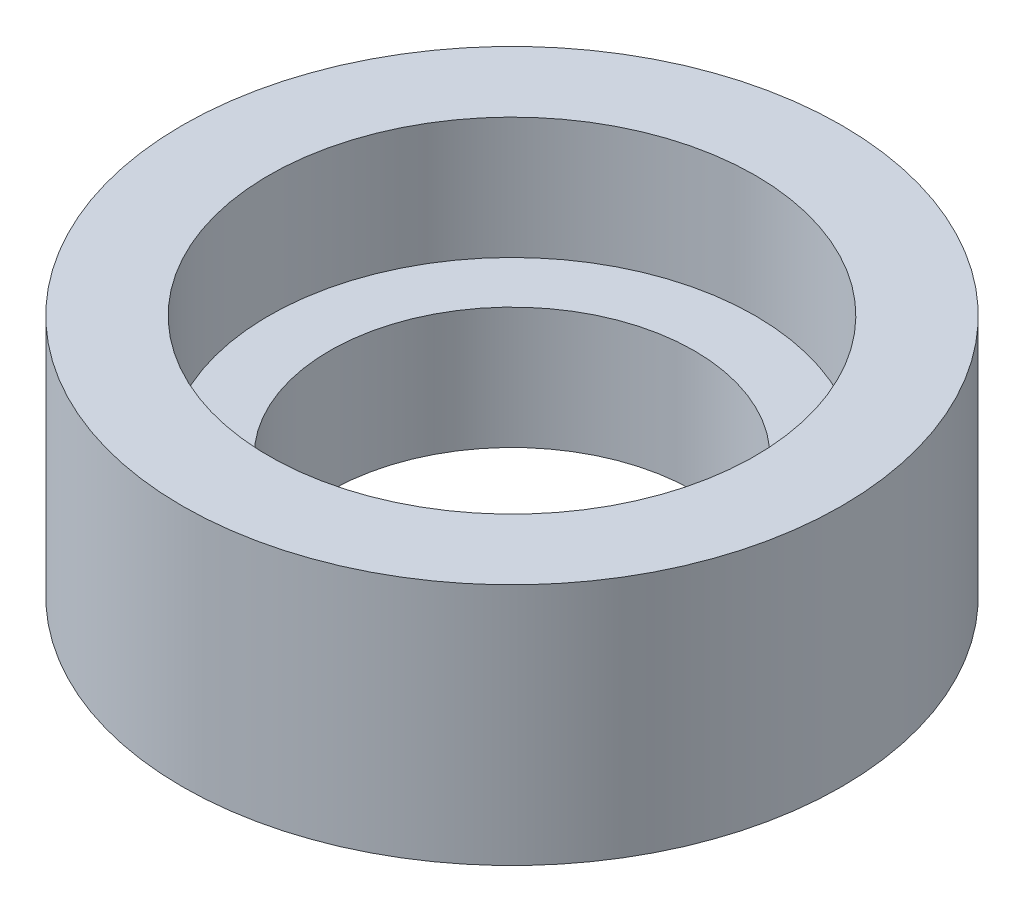
ISO-10303-21;
HEADER;
FILE_DESCRIPTION(('STEP AP214'),'2;1');
FILE_NAME('part.step','',(''),(''),'','','');
FILE_SCHEMA(('AUTOMOTIVE_DESIGN { 1 0 10303 214 1 1 1 1 }'));
ENDSEC;
DATA;
#1=APPLICATION_CONTEXT('core data for automotive mechanical design processes');
#2=APPLICATION_PROTOCOL_DEFINITION('international standard','automotive_design',2000,#1);
#3=PRODUCT_CONTEXT('',#1,'mechanical');
#4=PRODUCT('Part','Part','',(#3));
#5=PRODUCT_RELATED_PRODUCT_CATEGORY('part','',(#4));
#6=PRODUCT_DEFINITION_FORMATION('','',#4);
#7=PRODUCT_DEFINITION_CONTEXT('part definition',#1,'design');
#8=PRODUCT_DEFINITION('design','',#6,#7);
#9=PRODUCT_DEFINITION_SHAPE('','',#8);
#10=(LENGTH_UNIT() NAMED_UNIT(*) SI_UNIT(.MILLI.,.METRE.));
#11=(NAMED_UNIT(*) PLANE_ANGLE_UNIT() SI_UNIT($,.RADIAN.));
#12=(NAMED_UNIT(*) SI_UNIT($,.STERADIAN.) SOLID_ANGLE_UNIT());
#13=UNCERTAINTY_MEASURE_WITH_UNIT(LENGTH_MEASURE(1.E-05),#10,'distance_accuracy_value','');
#14=(GEOMETRIC_REPRESENTATION_CONTEXT(3) GLOBAL_UNCERTAINTY_ASSIGNED_CONTEXT((#13)) GLOBAL_UNIT_ASSIGNED_CONTEXT((#10,
#11,#12)) REPRESENTATION_CONTEXT('',''));
#15=CARTESIAN_POINT('',(0.,0.,0.));
#16=DIRECTION('',(0.,0.,1.));
#17=DIRECTION('',(1.,0.,0.));
#18=AXIS2_PLACEMENT_3D('',#15,#16,#17);
#19=CARTESIAN_POINT('',(-3.175,3.175,0.));
#20=DIRECTION('',(0.,-1.,0.));
#21=DIRECTION('',(0.,0.,-1.));
#22=AXIS2_PLACEMENT_3D('',#19,#20,#21);
#23=PLANE('',#22);
#24=CARTESIAN_POINT('',(0.,3.175,0.));
#25=DIRECTION('',(0.,-1.,0.));
#26=DIRECTION('',(0.,0.,-1.));
#27=AXIS2_PLACEMENT_3D('',#24,#25,#26);
#28=CIRCLE('',#27,4.3053);
#29=CARTESIAN_POINT('',(0.,3.175,-4.3053));
#30=VERTEX_POINT('',#29);
#31=EDGE_CURVE('E10',#30,#30,#28,.T.);
#32=ORIENTED_EDGE('',*,*,#31,.F.);
#33=EDGE_LOOP('',(#32));
#34=FACE_BOUND('',#33,.T.);
#35=CARTESIAN_POINT('',(0.,3.175,0.));
#36=DIRECTION('',(0.,-1.,0.));
#37=DIRECTION('',(0.,0.,-1.));
#38=AXIS2_PLACEMENT_3D('',#35,#36,#37);
#39=CIRCLE('',#38,3.175);
#40=CARTESIAN_POINT('',(0.,3.175,-3.175));
#41=VERTEX_POINT('',#40);
#42=EDGE_CURVE('E64',#41,#41,#39,.T.);
#43=ORIENTED_EDGE('',*,*,#42,.T.);
#44=EDGE_LOOP('',(#43));
#45=FACE_BOUND('',#44,.T.);
#46=ADVANCED_FACE('F37',(#34,#45),#23,.F.);
#47=CARTESIAN_POINT('',(0.,0.,0.));
#48=DIRECTION('',(0.,-1.,0.));
#49=DIRECTION('',(0.,0.,-1.));
#50=AXIS2_PLACEMENT_3D('',#47,#48,#49);
#51=CYLINDRICAL_SURFACE('',#50,4.3053);
#52=CARTESIAN_POINT('',(0.,0.,0.));
#53=DIRECTION('',(0.,-1.,0.));
#54=DIRECTION('',(0.,0.,-1.));
#55=AXIS2_PLACEMENT_3D('',#52,#53,#54);
#56=CIRCLE('',#55,4.3053);
#57=CARTESIAN_POINT('',(0.,0.,-4.3053));
#58=VERTEX_POINT('',#57);
#59=EDGE_CURVE('E44',#58,#58,#56,.T.);
#60=ORIENTED_EDGE('',*,*,#59,.F.);
#61=EDGE_LOOP('',(#60));
#62=FACE_BOUND('',#61,.T.);
#63=ORIENTED_EDGE('',*,*,#31,.T.);
#64=EDGE_LOOP('',(#63));
#65=FACE_BOUND('',#64,.T.);
#66=ADVANCED_FACE('F90',(#62,#65),#51,.T.);
#67=CARTESIAN_POINT('',(-4.3053,0.,0.));
#68=DIRECTION('',(0.,1.,0.));
#69=DIRECTION('',(0.,0.,1.));
#70=AXIS2_PLACEMENT_3D('',#67,#68,#69);
#71=PLANE('',#70);
#72=CARTESIAN_POINT('',(0.,0.,0.));
#73=DIRECTION('',(0.,-1.,0.));
#74=DIRECTION('',(0.,0.,-1.));
#75=AXIS2_PLACEMENT_3D('',#72,#73,#74);
#76=CIRCLE('',#75,2.38125);
#77=CARTESIAN_POINT('',(0.,0.,-2.38125));
#78=VERTEX_POINT('',#77);
#79=EDGE_CURVE('E49',#78,#78,#76,.T.);
#80=ORIENTED_EDGE('',*,*,#79,.F.);
#81=EDGE_LOOP('',(#80));
#82=FACE_BOUND('',#81,.T.);
#83=ORIENTED_EDGE('',*,*,#59,.T.);
#84=EDGE_LOOP('',(#83));
#85=FACE_BOUND('',#84,.T.);
#86=ADVANCED_FACE('F85',(#82,#85),#71,.F.);
#87=CARTESIAN_POINT('',(0.,0.,0.));
#88=DIRECTION('',(0.,-1.,0.));
#89=DIRECTION('',(0.,0.,-1.));
#90=AXIS2_PLACEMENT_3D('',#87,#88,#89);
#91=CYLINDRICAL_SURFACE('',#90,2.38125);
#92=CARTESIAN_POINT('',(0.,1.5875,0.));
#93=DIRECTION('',(0.,-1.,0.));
#94=DIRECTION('',(0.,0.,-1.));
#95=AXIS2_PLACEMENT_3D('',#92,#93,#94);
#96=CIRCLE('',#95,2.38125);
#97=CARTESIAN_POINT('',(0.,1.5875,-2.38125));
#98=VERTEX_POINT('',#97);
#99=EDGE_CURVE('E54',#98,#98,#96,.T.);
#100=ORIENTED_EDGE('',*,*,#99,.F.);
#101=EDGE_LOOP('',(#100));
#102=FACE_BOUND('',#101,.T.);
#103=ORIENTED_EDGE('',*,*,#79,.T.);
#104=EDGE_LOOP('',(#103));
#105=FACE_BOUND('',#104,.T.);
#106=ADVANCED_FACE('F79',(#102,#105),#91,.F.);
#107=CARTESIAN_POINT('',(-2.38125,1.5875,0.));
#108=DIRECTION('',(0.,-1.,0.));
#109=DIRECTION('',(0.,0.,-1.));
#110=AXIS2_PLACEMENT_3D('',#107,#108,#109);
#111=PLANE('',#110);
#112=CARTESIAN_POINT('',(0.,1.5875,0.));
#113=DIRECTION('',(0.,-1.,0.));
#114=DIRECTION('',(0.,0.,-1.));
#115=AXIS2_PLACEMENT_3D('',#112,#113,#114);
#116=CIRCLE('',#115,3.175);
#117=CARTESIAN_POINT('',(0.,1.5875,-3.175));
#118=VERTEX_POINT('',#117);
#119=EDGE_CURVE('E60',#118,#118,#116,.T.);
#120=ORIENTED_EDGE('',*,*,#119,.F.);
#121=EDGE_LOOP('',(#120));
#122=FACE_BOUND('',#121,.T.);
#123=ORIENTED_EDGE('',*,*,#99,.T.);
#124=EDGE_LOOP('',(#123));
#125=FACE_BOUND('',#124,.T.);
#126=ADVANCED_FACE('F73',(#122,#125),#111,.F.);
#127=CARTESIAN_POINT('',(0.,0.,0.));
#128=DIRECTION('',(0.,-1.,0.));
#129=DIRECTION('',(0.,0.,-1.));
#130=AXIS2_PLACEMENT_3D('',#127,#128,#129);
#131=CYLINDRICAL_SURFACE('',#130,3.175);
#132=ORIENTED_EDGE('',*,*,#42,.F.);
#133=EDGE_LOOP('',(#132));
#134=FACE_BOUND('',#133,.T.);
#135=ORIENTED_EDGE('',*,*,#119,.T.);
#136=EDGE_LOOP('',(#135));
#137=FACE_BOUND('',#136,.T.);
#138=ADVANCED_FACE('F70',(#134,#137),#131,.F.);
#139=CLOSED_SHELL('',(#46,#66,#86,#106,#126,#138));
#140=MANIFOLD_SOLID_BREP('B2',#139);
#141=ADVANCED_BREP_SHAPE_REPRESENTATION('',(#18,#140),#14);
#142=SHAPE_DEFINITION_REPRESENTATION(#9,#141);
ENDSEC;
END-ISO-10303-21;
